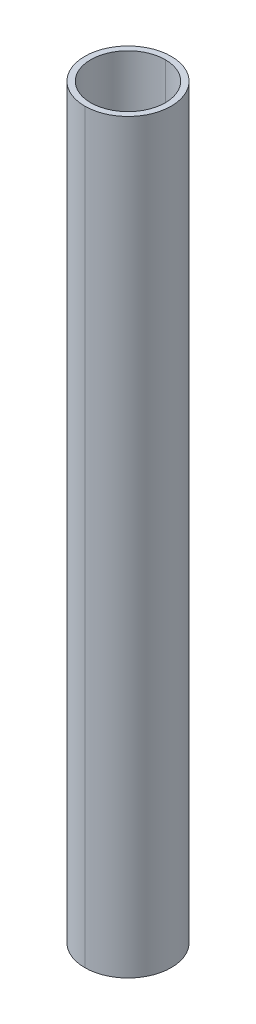
ISO-10303-21;
HEADER;
FILE_DESCRIPTION(('STEP AP214'),'2;1');
FILE_NAME('part.step','',(''),(''),'','','');
FILE_SCHEMA(('AUTOMOTIVE_DESIGN { 1 0 10303 214 1 1 1 1 }'));
ENDSEC;
DATA;
#1=APPLICATION_CONTEXT('core data for automotive mechanical design processes');
#2=APPLICATION_PROTOCOL_DEFINITION('international standard','automotive_design',2000,#1);
#3=PRODUCT_CONTEXT('',#1,'mechanical');
#4=PRODUCT('Part','Part','',(#3));
#5=PRODUCT_RELATED_PRODUCT_CATEGORY('part','',(#4));
#6=PRODUCT_DEFINITION_FORMATION('','',#4);
#7=PRODUCT_DEFINITION_CONTEXT('part definition',#1,'design');
#8=PRODUCT_DEFINITION('design','',#6,#7);
#9=PRODUCT_DEFINITION_SHAPE('','',#8);
#10=(LENGTH_UNIT() NAMED_UNIT(*) SI_UNIT(.MILLI.,.METRE.));
#11=(NAMED_UNIT(*) PLANE_ANGLE_UNIT() SI_UNIT($,.RADIAN.));
#12=(NAMED_UNIT(*) SI_UNIT($,.STERADIAN.) SOLID_ANGLE_UNIT());
#13=UNCERTAINTY_MEASURE_WITH_UNIT(LENGTH_MEASURE(1.E-05),#10,'distance_accuracy_value','');
#14=(GEOMETRIC_REPRESENTATION_CONTEXT(3) GLOBAL_UNCERTAINTY_ASSIGNED_CONTEXT((#13)) GLOBAL_UNIT_ASSIGNED_CONTEXT((#10,
#11,#12)) REPRESENTATION_CONTEXT('',''));
#15=CARTESIAN_POINT('',(0.,0.,0.));
#16=DIRECTION('',(0.,0.,1.));
#17=DIRECTION('',(1.,0.,0.));
#18=AXIS2_PLACEMENT_3D('',#15,#16,#17);
#19=CARTESIAN_POINT('',(11.,190.,0.));
#20=DIRECTION('',(0.,1.,0.));
#21=DIRECTION('',(0.,0.,1.));
#22=AXIS2_PLACEMENT_3D('',#19,#20,#21);
#23=PLANE('',#22);
#24=CARTESIAN_POINT('',(0.,190.,0.));
#25=DIRECTION('',(0.,-1.,0.));
#26=DIRECTION('',(0.,0.,-1.));
#27=AXIS2_PLACEMENT_3D('',#24,#25,#26);
#28=CIRCLE('',#27,9.5);
#29=CARTESIAN_POINT('',(0.,190.,-9.5));
#30=VERTEX_POINT('',#29);
#31=CARTESIAN_POINT('',(0.,190.,9.5));
#32=VERTEX_POINT('',#31);
#33=EDGE_CURVE('E11',#30,#32,#28,.T.);
#34=ORIENTED_EDGE('',*,*,#33,.T.);
#35=CARTESIAN_POINT('',(0.,190.,0.));
#36=DIRECTION('',(0.,-1.,0.));
#37=DIRECTION('',(0.,0.,-1.));
#38=AXIS2_PLACEMENT_3D('',#35,#36,#37);
#39=CIRCLE('',#38,9.5);
#40=EDGE_CURVE('E25',#32,#30,#39,.T.);
#41=ORIENTED_EDGE('',*,*,#40,.T.);
#42=EDGE_LOOP('',(#34,#41));
#43=FACE_BOUND('',#42,.T.);
#44=CARTESIAN_POINT('',(0.,190.,0.));
#45=DIRECTION('',(0.,-1.,0.));
#46=DIRECTION('',(0.,0.,-1.));
#47=AXIS2_PLACEMENT_3D('',#44,#45,#46);
#48=CIRCLE('',#47,11.);
#49=CARTESIAN_POINT('',(0.,190.,11.));
#50=VERTEX_POINT('',#49);
#51=CARTESIAN_POINT('',(0.,190.,-11.));
#52=VERTEX_POINT('',#51);
#53=EDGE_CURVE('E95',#50,#52,#48,.T.);
#54=ORIENTED_EDGE('',*,*,#53,.F.);
#55=CARTESIAN_POINT('',(0.,190.,0.));
#56=DIRECTION('',(0.,-1.,0.));
#57=DIRECTION('',(0.,0.,-1.));
#58=AXIS2_PLACEMENT_3D('',#55,#56,#57);
#59=CIRCLE('',#58,11.);
#60=EDGE_CURVE('E90',#52,#50,#59,.T.);
#61=ORIENTED_EDGE('',*,*,#60,.F.);
#62=EDGE_LOOP('',(#54,#61));
#63=FACE_BOUND('',#62,.T.);
#64=ADVANCED_FACE('F17',(#43,#63),#23,.T.);
#65=CARTESIAN_POINT('',(0.,0.,0.));
#66=DIRECTION('',(0.,-1.,0.));
#67=DIRECTION('',(-1.,0.,0.));
#68=AXIS2_PLACEMENT_3D('',#65,#66,#67);
#69=CYLINDRICAL_SURFACE('',#68,11.);
#70=DIRECTION('',(0.,-1.,0.));
#71=VECTOR('',#70,1.);
#72=CARTESIAN_POINT('',(0.,190.,11.));
#73=LINE('',#72,#71);
#74=CARTESIAN_POINT('',(0.,0.,11.));
#75=VERTEX_POINT('',#74);
#76=EDGE_CURVE('E86',#50,#75,#73,.T.);
#77=ORIENTED_EDGE('',*,*,#76,.T.);
#78=CARTESIAN_POINT('',(0.,0.,0.));
#79=DIRECTION('',(0.,-1.,0.));
#80=DIRECTION('',(0.,0.,-1.));
#81=AXIS2_PLACEMENT_3D('',#78,#79,#80);
#82=CIRCLE('',#81,11.);
#83=CARTESIAN_POINT('',(0.,0.,-11.));
#84=VERTEX_POINT('',#83);
#85=EDGE_CURVE('E81',#84,#75,#82,.T.);
#86=ORIENTED_EDGE('',*,*,#85,.F.);
#87=DIRECTION('',(0.,-1.,0.));
#88=VECTOR('',#87,1.);
#89=CARTESIAN_POINT('',(0.,190.,-11.));
#90=LINE('',#89,#88);
#91=EDGE_CURVE('E70',#52,#84,#90,.T.);
#92=ORIENTED_EDGE('',*,*,#91,.F.);
#93=ORIENTED_EDGE('',*,*,#60,.T.);
#94=EDGE_LOOP('',(#77,#86,#92,#93));
#95=FACE_BOUND('',#94,.T.);
#96=ADVANCED_FACE('F111',(#95),#69,.T.);
#97=CARTESIAN_POINT('',(0.,0.,0.));
#98=DIRECTION('',(0.,-1.,0.));
#99=DIRECTION('',(1.,0.,0.));
#100=AXIS2_PLACEMENT_3D('',#97,#98,#99);
#101=CYLINDRICAL_SURFACE('',#100,11.);
#102=ORIENTED_EDGE('',*,*,#76,.F.);
#103=ORIENTED_EDGE('',*,*,#53,.T.);
#104=ORIENTED_EDGE('',*,*,#91,.T.);
#105=CARTESIAN_POINT('',(0.,0.,0.));
#106=DIRECTION('',(0.,-1.,0.));
#107=DIRECTION('',(0.,0.,-1.));
#108=AXIS2_PLACEMENT_3D('',#105,#106,#107);
#109=CIRCLE('',#108,11.);
#110=EDGE_CURVE('E67',#75,#84,#109,.T.);
#111=ORIENTED_EDGE('',*,*,#110,.F.);
#112=EDGE_LOOP('',(#102,#103,#104,#111));
#113=FACE_BOUND('',#112,.T.);
#114=ADVANCED_FACE('F106',(#113),#101,.T.);
#115=CARTESIAN_POINT('',(9.5,0.,0.));
#116=DIRECTION('',(0.,-1.,0.));
#117=DIRECTION('',(0.,0.,-1.));
#118=AXIS2_PLACEMENT_3D('',#115,#116,#117);
#119=PLANE('',#118);
#120=ORIENTED_EDGE('',*,*,#85,.T.);
#121=ORIENTED_EDGE('',*,*,#110,.T.);
#122=EDGE_LOOP('',(#120,#121));
#123=FACE_BOUND('',#122,.T.);
#124=CARTESIAN_POINT('',(0.,0.,0.));
#125=DIRECTION('',(0.,-1.,0.));
#126=DIRECTION('',(0.,0.,-1.));
#127=AXIS2_PLACEMENT_3D('',#124,#125,#126);
#128=CIRCLE('',#127,9.5);
#129=CARTESIAN_POINT('',(0.,0.,9.5));
#130=VERTEX_POINT('',#129);
#131=CARTESIAN_POINT('',(0.,0.,-9.5));
#132=VERTEX_POINT('',#131);
#133=EDGE_CURVE('E55',#130,#132,#128,.T.);
#134=ORIENTED_EDGE('',*,*,#133,.F.);
#135=CARTESIAN_POINT('',(0.,0.,0.));
#136=DIRECTION('',(0.,-1.,0.));
#137=DIRECTION('',(0.,0.,-1.));
#138=AXIS2_PLACEMENT_3D('',#135,#136,#137);
#139=CIRCLE('',#138,9.5);
#140=EDGE_CURVE('E51',#132,#130,#139,.T.);
#141=ORIENTED_EDGE('',*,*,#140,.F.);
#142=EDGE_LOOP('',(#134,#141));
#143=FACE_BOUND('',#142,.T.);
#144=ADVANCED_FACE('F53',(#123,#143),#119,.T.);
#145=CARTESIAN_POINT('',(0.,0.,0.));
#146=DIRECTION('',(0.,-1.,0.));
#147=DIRECTION('',(-1.,0.,0.));
#148=AXIS2_PLACEMENT_3D('',#145,#146,#147);
#149=CYLINDRICAL_SURFACE('',#148,9.5);
#150=DIRECTION('',(0.,-1.,0.));
#151=VECTOR('',#150,1.);
#152=CARTESIAN_POINT('',(0.,190.,9.5));
#153=LINE('',#152,#151);
#154=EDGE_CURVE('E59',#32,#130,#153,.T.);
#155=ORIENTED_EDGE('',*,*,#154,.F.);
#156=ORIENTED_EDGE('',*,*,#33,.F.);
#157=DIRECTION('',(0.,-1.,0.));
#158=VECTOR('',#157,1.);
#159=CARTESIAN_POINT('',(0.,190.,-9.5));
#160=LINE('',#159,#158);
#161=EDGE_CURVE('E62',#30,#132,#160,.T.);
#162=ORIENTED_EDGE('',*,*,#161,.T.);
#163=ORIENTED_EDGE('',*,*,#140,.T.);
#164=EDGE_LOOP('',(#155,#156,#162,#163));
#165=FACE_BOUND('',#164,.T.);
#166=ADVANCED_FACE('F63',(#165),#149,.F.);
#167=CARTESIAN_POINT('',(0.,0.,0.));
#168=DIRECTION('',(0.,-1.,0.));
#169=DIRECTION('',(1.,0.,0.));
#170=AXIS2_PLACEMENT_3D('',#167,#168,#169);
#171=CYLINDRICAL_SURFACE('',#170,9.5);
#172=ORIENTED_EDGE('',*,*,#154,.T.);
#173=ORIENTED_EDGE('',*,*,#133,.T.);
#174=ORIENTED_EDGE('',*,*,#161,.F.);
#175=ORIENTED_EDGE('',*,*,#40,.F.);
#176=EDGE_LOOP('',(#172,#173,#174,#175));
#177=FACE_BOUND('',#176,.T.);
#178=ADVANCED_FACE('F66',(#177),#171,.F.);
#179=CLOSED_SHELL('',(#64,#96,#114,#144,#166,#178));
#180=MANIFOLD_SOLID_BREP('B1',#179);
#181=ADVANCED_BREP_SHAPE_REPRESENTATION('',(#18,#180),#14);
#182=SHAPE_DEFINITION_REPRESENTATION(#9,#181);
ENDSEC;
END-ISO-10303-21;
